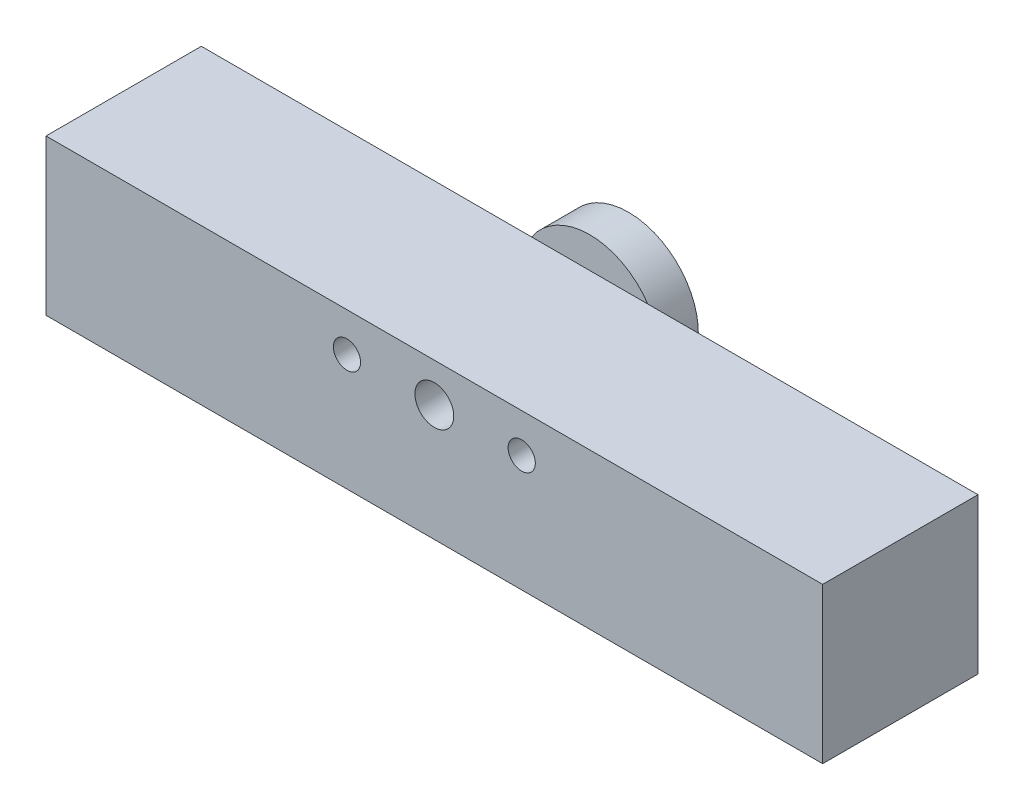
ISO-10303-21;
HEADER;
FILE_DESCRIPTION(('STEP AP214'),'2;1');
FILE_NAME('part.step','',(''),(''),'','','');
FILE_SCHEMA(('AUTOMOTIVE_DESIGN { 1 0 10303 214 1 1 1 1 }'));
ENDSEC;
DATA;
#1=APPLICATION_CONTEXT('core data for automotive mechanical design processes');
#2=APPLICATION_PROTOCOL_DEFINITION('international standard','automotive_design',2000,#1);
#3=PRODUCT_CONTEXT('',#1,'mechanical');
#4=PRODUCT('Part','Part','',(#3));
#5=PRODUCT_RELATED_PRODUCT_CATEGORY('part','',(#4));
#6=PRODUCT_DEFINITION_FORMATION('','',#4);
#7=PRODUCT_DEFINITION_CONTEXT('part definition',#1,'design');
#8=PRODUCT_DEFINITION('design','',#6,#7);
#9=PRODUCT_DEFINITION_SHAPE('','',#8);
#10=(LENGTH_UNIT() NAMED_UNIT(*) SI_UNIT(.MILLI.,.METRE.));
#11=(NAMED_UNIT(*) PLANE_ANGLE_UNIT() SI_UNIT($,.RADIAN.));
#12=(NAMED_UNIT(*) SI_UNIT($,.STERADIAN.) SOLID_ANGLE_UNIT());
#13=UNCERTAINTY_MEASURE_WITH_UNIT(LENGTH_MEASURE(1.E-05),#10,'distance_accuracy_value','');
#14=(GEOMETRIC_REPRESENTATION_CONTEXT(3) GLOBAL_UNCERTAINTY_ASSIGNED_CONTEXT((#13)) GLOBAL_UNIT_ASSIGNED_CONTEXT((#10,
#11,#12)) REPRESENTATION_CONTEXT('',''));
#15=CARTESIAN_POINT('',(0.,0.,0.));
#16=DIRECTION('',(0.,0.,1.));
#17=DIRECTION('',(1.,0.,0.));
#18=AXIS2_PLACEMENT_3D('',#15,#16,#17);
#19=CARTESIAN_POINT('',(0.,40.,0.));
#20=DIRECTION('',(1.,0.,0.));
#21=DIRECTION('',(0.,0.,-1.));
#22=AXIS2_PLACEMENT_3D('',#19,#20,#21);
#23=PLANE('',#22);
#24=DIRECTION('',(0.,0.,1.));
#25=VECTOR('',#24,1.);
#26=CARTESIAN_POINT('',(0.,0.,0.));
#27=LINE('',#26,#25);
#28=CARTESIAN_POINT('',(0.,0.,-40.));
#29=VERTEX_POINT('',#28);
#30=CARTESIAN_POINT('',(0.,0.,0.));
#31=VERTEX_POINT('',#30);
#32=EDGE_CURVE('E117',#29,#31,#27,.T.);
#33=ORIENTED_EDGE('',*,*,#32,.T.);
#34=DIRECTION('',(0.,-1.,0.));
#35=VECTOR('',#34,1.);
#36=CARTESIAN_POINT('',(0.,40.,0.));
#37=LINE('',#36,#35);
#38=CARTESIAN_POINT('',(0.,40.,0.));
#39=VERTEX_POINT('',#38);
#40=EDGE_CURVE('E48',#39,#31,#37,.T.);
#41=ORIENTED_EDGE('',*,*,#40,.F.);
#42=DIRECTION('',(0.,0.,1.));
#43=VECTOR('',#42,1.);
#44=CARTESIAN_POINT('',(0.,40.,0.));
#45=LINE('',#44,#43);
#46=CARTESIAN_POINT('',(0.,40.,-40.));
#47=VERTEX_POINT('',#46);
#48=EDGE_CURVE('E123',#47,#39,#45,.T.);
#49=ORIENTED_EDGE('',*,*,#48,.F.);
#50=DIRECTION('',(0.,-1.,0.));
#51=VECTOR('',#50,1.);
#52=CARTESIAN_POINT('',(0.,40.,-40.));
#53=LINE('',#52,#51);
#54=EDGE_CURVE('E104',#47,#29,#53,.T.);
#55=ORIENTED_EDGE('',*,*,#54,.T.);
#56=EDGE_LOOP('',(#33,#41,#49,#55));
#57=FACE_BOUND('',#56,.T.);
#58=ADVANCED_FACE('F39',(#57),#23,.F.);
#59=CARTESIAN_POINT('',(0.,40.,0.));
#60=DIRECTION('',(0.,0.,-1.));
#61=DIRECTION('',(-1.,0.,0.));
#62=AXIS2_PLACEMENT_3D('',#59,#60,#61);
#63=PLANE('',#62);
#64=CARTESIAN_POINT('',(77.5,30.,0.));
#65=DIRECTION('',(0.,0.,-1.));
#66=DIRECTION('',(-1.,0.,0.));
#67=AXIS2_PLACEMENT_3D('',#64,#65,#66);
#68=CIRCLE('',#67,3.50000000000001);
#69=CARTESIAN_POINT('',(74.,30.,0.));
#70=VERTEX_POINT('',#69);
#71=EDGE_CURVE('E165',#70,#70,#68,.T.);
#72=ORIENTED_EDGE('',*,*,#71,.T.);
#73=EDGE_LOOP('',(#72));
#74=FACE_BOUND('',#73,.T.);
#75=CARTESIAN_POINT('',(122.5,30.,0.));
#76=DIRECTION('',(0.,0.,-1.));
#77=DIRECTION('',(-1.,0.,0.));
#78=AXIS2_PLACEMENT_3D('',#75,#76,#77);
#79=CIRCLE('',#78,3.50000000000002);
#80=CARTESIAN_POINT('',(119.,30.,0.));
#81=VERTEX_POINT('',#80);
#82=EDGE_CURVE('E155',#81,#81,#79,.T.);
#83=ORIENTED_EDGE('',*,*,#82,.T.);
#84=EDGE_LOOP('',(#83));
#85=FACE_BOUND('',#84,.T.);
#86=CARTESIAN_POINT('',(100.,30.,0.));
#87=DIRECTION('',(0.,0.,-1.));
#88=DIRECTION('',(-1.,0.,0.));
#89=AXIS2_PLACEMENT_3D('',#86,#87,#88);
#90=CIRCLE('',#89,5.00000000000001);
#91=CARTESIAN_POINT('',(95.,30.,0.));
#92=VERTEX_POINT('',#91);
#93=EDGE_CURVE('E113',#92,#92,#90,.T.);
#94=ORIENTED_EDGE('',*,*,#93,.T.);
#95=EDGE_LOOP('',(#94));
#96=FACE_BOUND('',#95,.T.);
#97=DIRECTION('',(1.,0.,0.));
#98=VECTOR('',#97,1.);
#99=CARTESIAN_POINT('',(0.,0.,0.));
#100=LINE('',#99,#98);
#101=CARTESIAN_POINT('',(200.,0.,0.));
#102=VERTEX_POINT('',#101);
#103=EDGE_CURVE('E134',#31,#102,#100,.T.);
#104=ORIENTED_EDGE('',*,*,#103,.T.);
#105=DIRECTION('',(0.,-1.,0.));
#106=VECTOR('',#105,1.);
#107=CARTESIAN_POINT('',(200.,40.,0.));
#108=LINE('',#107,#106);
#109=CARTESIAN_POINT('',(200.,40.,0.));
#110=VERTEX_POINT('',#109);
#111=EDGE_CURVE('E147',#110,#102,#108,.T.);
#112=ORIENTED_EDGE('',*,*,#111,.F.);
#113=DIRECTION('',(1.,0.,0.));
#114=VECTOR('',#113,1.);
#115=CARTESIAN_POINT('',(0.,40.,0.));
#116=LINE('',#115,#114);
#117=EDGE_CURVE('E92',#39,#110,#116,.T.);
#118=ORIENTED_EDGE('',*,*,#117,.F.);
#119=ORIENTED_EDGE('',*,*,#40,.T.);
#120=EDGE_LOOP('',(#104,#112,#118,#119));
#121=FACE_BOUND('',#120,.T.);
#122=ADVANCED_FACE('F194',(#74,#85,#96,#121),#63,.F.);
#123=CARTESIAN_POINT('',(200.,40.,0.));
#124=DIRECTION('',(-1.,0.,0.));
#125=DIRECTION('',(0.,0.,1.));
#126=AXIS2_PLACEMENT_3D('',#123,#124,#125);
#127=PLANE('',#126);
#128=DIRECTION('',(0.,0.,-1.));
#129=VECTOR('',#128,1.);
#130=CARTESIAN_POINT('',(200.,0.,0.));
#131=LINE('',#130,#129);
#132=CARTESIAN_POINT('',(200.,0.,-40.));
#133=VERTEX_POINT('',#132);
#134=EDGE_CURVE('E137',#102,#133,#131,.T.);
#135=ORIENTED_EDGE('',*,*,#134,.T.);
#136=DIRECTION('',(0.,-1.,0.));
#137=VECTOR('',#136,1.);
#138=CARTESIAN_POINT('',(200.,40.,-40.));
#139=LINE('',#138,#137);
#140=CARTESIAN_POINT('',(200.,40.,-40.));
#141=VERTEX_POINT('',#140);
#142=EDGE_CURVE('E144',#141,#133,#139,.T.);
#143=ORIENTED_EDGE('',*,*,#142,.F.);
#144=DIRECTION('',(0.,0.,-1.));
#145=VECTOR('',#144,1.);
#146=CARTESIAN_POINT('',(200.,40.,0.));
#147=LINE('',#146,#145);
#148=EDGE_CURVE('E107',#110,#141,#147,.T.);
#149=ORIENTED_EDGE('',*,*,#148,.F.);
#150=ORIENTED_EDGE('',*,*,#111,.T.);
#151=EDGE_LOOP('',(#135,#143,#149,#150));
#152=FACE_BOUND('',#151,.T.);
#153=ADVANCED_FACE('F199',(#152),#127,.F.);
#154=CARTESIAN_POINT('',(0.,40.,-40.));
#155=DIRECTION('',(0.,0.,1.));
#156=DIRECTION('',(1.,0.,0.));
#157=AXIS2_PLACEMENT_3D('',#154,#155,#156);
#158=PLANE('',#157);
#159=CARTESIAN_POINT('',(77.5,30.,-40.));
#160=DIRECTION('',(0.,0.,1.));
#161=DIRECTION('',(1.,0.,0.));
#162=AXIS2_PLACEMENT_3D('',#159,#160,#161);
#163=CIRCLE('',#162,3.50000000000001);
#164=CARTESIAN_POINT('',(81.,30.,-40.));
#165=VERTEX_POINT('',#164);
#166=EDGE_CURVE('E42',#165,#165,#163,.T.);
#167=ORIENTED_EDGE('',*,*,#166,.T.);
#168=EDGE_LOOP('',(#167));
#169=FACE_BOUND('',#168,.T.);
#170=CARTESIAN_POINT('',(122.5,30.,-40.));
#171=DIRECTION('',(0.,0.,1.));
#172=DIRECTION('',(1.,0.,0.));
#173=AXIS2_PLACEMENT_3D('',#170,#171,#172);
#174=CIRCLE('',#173,3.50000000000002);
#175=CARTESIAN_POINT('',(126.,30.,-40.));
#176=VERTEX_POINT('',#175);
#177=EDGE_CURVE('E152',#176,#176,#174,.T.);
#178=ORIENTED_EDGE('',*,*,#177,.T.);
#179=EDGE_LOOP('',(#178));
#180=FACE_BOUND('',#179,.T.);
#181=CARTESIAN_POINT('',(100.,30.,-40.));
#182=DIRECTION('',(0.,0.,-1.));
#183=DIRECTION('',(-1.,0.,0.));
#184=AXIS2_PLACEMENT_3D('',#181,#182,#183);
#185=CIRCLE('',#184,18.);
#186=CARTESIAN_POINT('',(114.966629547096,40.,-40.));
#187=VERTEX_POINT('',#186);
#188=CARTESIAN_POINT('',(85.0333704529042,40.,-40.));
#189=VERTEX_POINT('',#188);
#190=EDGE_CURVE('E11',#187,#189,#185,.T.);
#191=ORIENTED_EDGE('',*,*,#190,.F.);
#192=DIRECTION('',(-1.,0.,0.));
#193=VECTOR('',#192,1.);
#194=CARTESIAN_POINT('',(0.,40.,-40.));
#195=LINE('',#194,#193);
#196=EDGE_CURVE('E97',#141,#187,#195,.T.);
#197=ORIENTED_EDGE('',*,*,#196,.F.);
#198=ORIENTED_EDGE('',*,*,#142,.T.);
#199=DIRECTION('',(-1.,0.,0.));
#200=VECTOR('',#199,1.);
#201=CARTESIAN_POINT('',(0.,0.,-40.));
#202=LINE('',#201,#200);
#203=EDGE_CURVE('E84',#133,#29,#202,.T.);
#204=ORIENTED_EDGE('',*,*,#203,.T.);
#205=ORIENTED_EDGE('',*,*,#54,.F.);
#206=EDGE_CURVE('E63',#189,#47,#195,.T.);
#207=ORIENTED_EDGE('',*,*,#206,.F.);
#208=EDGE_LOOP('',(#191,#197,#198,#204,#205,#207));
#209=FACE_BOUND('',#208,.T.);
#210=ADVANCED_FACE('F103',(#169,#180,#209),#158,.F.);
#211=CARTESIAN_POINT('',(0.,40.,0.));
#212=DIRECTION('',(0.,-1.,0.));
#213=DIRECTION('',(0.,0.,-1.));
#214=AXIS2_PLACEMENT_3D('',#211,#212,#213);
#215=PLANE('',#214);
#216=ORIENTED_EDGE('',*,*,#48,.T.);
#217=ORIENTED_EDGE('',*,*,#117,.T.);
#218=ORIENTED_EDGE('',*,*,#148,.T.);
#219=ORIENTED_EDGE('',*,*,#196,.T.);
#220=EDGE_CURVE('E95',#187,#189,#195,.T.);
#221=ORIENTED_EDGE('',*,*,#220,.T.);
#222=ORIENTED_EDGE('',*,*,#206,.T.);
#223=EDGE_LOOP('',(#216,#217,#218,#219,#221,#222));
#224=FACE_BOUND('',#223,.T.);
#225=ADVANCED_FACE('F96',(#224),#215,.F.);
#226=CARTESIAN_POINT('',(0.,0.,0.));
#227=DIRECTION('',(0.,-1.,0.));
#228=DIRECTION('',(0.,0.,-1.));
#229=AXIS2_PLACEMENT_3D('',#226,#227,#228);
#230=PLANE('',#229);
#231=ORIENTED_EDGE('',*,*,#32,.F.);
#232=ORIENTED_EDGE('',*,*,#203,.F.);
#233=ORIENTED_EDGE('',*,*,#134,.F.);
#234=ORIENTED_EDGE('',*,*,#103,.F.);
#235=EDGE_LOOP('',(#231,#232,#233,#234));
#236=FACE_BOUND('',#235,.T.);
#237=ADVANCED_FACE('F184',(#236),#230,.T.);
#238=CARTESIAN_POINT('',(100.,30.,-50.));
#239=DIRECTION('',(0.,0.,1.));
#240=DIRECTION('',(1.,0.,0.));
#241=AXIS2_PLACEMENT_3D('',#238,#239,#240);
#242=CYLINDRICAL_SURFACE('',#241,18.);
#243=CARTESIAN_POINT('',(100.,30.,-50.));
#244=DIRECTION('',(0.,0.,-1.));
#245=DIRECTION('',(-1.,0.,0.));
#246=AXIS2_PLACEMENT_3D('',#243,#244,#245);
#247=CIRCLE('',#246,18.);
#248=CARTESIAN_POINT('',(82.,30.,-50.));
#249=VERTEX_POINT('',#248);
#250=EDGE_CURVE('E112',#249,#249,#247,.T.);
#251=ORIENTED_EDGE('',*,*,#250,.F.);
#252=EDGE_LOOP('',(#251));
#253=FACE_BOUND('',#252,.T.);
#254=EDGE_CURVE('E50',#189,#187,#185,.T.);
#255=ORIENTED_EDGE('',*,*,#254,.T.);
#256=ORIENTED_EDGE('',*,*,#190,.T.);
#257=EDGE_LOOP('',(#255,#256));
#258=FACE_BOUND('',#257,.T.);
#259=ADVANCED_FACE('F109',(#253,#258),#242,.T.);
#260=CARTESIAN_POINT('',(100.,30.,-50.));
#261=DIRECTION('',(0.,0.,-1.));
#262=DIRECTION('',(-1.,0.,0.));
#263=AXIS2_PLACEMENT_3D('',#260,#261,#262);
#264=PLANE('',#263);
#265=CARTESIAN_POINT('',(100.,30.,-50.));
#266=DIRECTION('',(0.,0.,-1.));
#267=DIRECTION('',(-1.,0.,0.));
#268=AXIS2_PLACEMENT_3D('',#265,#266,#267);
#269=CIRCLE('',#268,5.00000000000001);
#270=CARTESIAN_POINT('',(95.,30.,-50.));
#271=VERTEX_POINT('',#270);
#272=EDGE_CURVE('E120',#271,#271,#269,.T.);
#273=ORIENTED_EDGE('',*,*,#272,.F.);
#274=EDGE_LOOP('',(#273));
#275=FACE_BOUND('',#274,.T.);
#276=ORIENTED_EDGE('',*,*,#250,.T.);
#277=EDGE_LOOP('',(#276));
#278=FACE_BOUND('',#277,.T.);
#279=ADVANCED_FACE('F177',(#275,#278),#264,.T.);
#280=CARTESIAN_POINT('',(100.,30.,-40.));
#281=DIRECTION('',(0.,0.,-1.));
#282=DIRECTION('',(-1.,0.,0.));
#283=AXIS2_PLACEMENT_3D('',#280,#281,#282);
#284=PLANE('',#283);
#285=ORIENTED_EDGE('',*,*,#220,.F.);
#286=ORIENTED_EDGE('',*,*,#254,.F.);
#287=EDGE_LOOP('',(#285,#286));
#288=FACE_BOUND('',#287,.T.);
#289=ADVANCED_FACE('F110',(#288),#284,.F.);
#290=CARTESIAN_POINT('',(100.,30.,0.999999999999994));
#291=DIRECTION('',(0.,0.,-1.));
#292=DIRECTION('',(-1.,0.,0.));
#293=AXIS2_PLACEMENT_3D('',#290,#291,#292);
#294=CYLINDRICAL_SURFACE('',#293,5.00000000000001);
#295=ORIENTED_EDGE('',*,*,#272,.T.);
#296=EDGE_LOOP('',(#295));
#297=FACE_BOUND('',#296,.T.);
#298=ORIENTED_EDGE('',*,*,#93,.F.);
#299=EDGE_LOOP('',(#298));
#300=FACE_BOUND('',#299,.T.);
#301=ADVANCED_FACE('F174',(#297,#300),#294,.F.);
#302=CARTESIAN_POINT('',(122.5,30.,0.999999999999994));
#303=DIRECTION('',(0.,0.,-1.));
#304=DIRECTION('',(-1.,0.,0.));
#305=AXIS2_PLACEMENT_3D('',#302,#303,#304);
#306=CYLINDRICAL_SURFACE('',#305,3.50000000000002);
#307=ORIENTED_EDGE('',*,*,#177,.F.);
#308=EDGE_LOOP('',(#307));
#309=FACE_BOUND('',#308,.T.);
#310=ORIENTED_EDGE('',*,*,#82,.F.);
#311=EDGE_LOOP('',(#310));
#312=FACE_BOUND('',#311,.T.);
#313=ADVANCED_FACE('F252',(#309,#312),#306,.F.);
#314=CARTESIAN_POINT('',(77.5,30.,0.999999999999994));
#315=DIRECTION('',(0.,0.,-1.));
#316=DIRECTION('',(-1.,0.,0.));
#317=AXIS2_PLACEMENT_3D('',#314,#315,#316);
#318=CYLINDRICAL_SURFACE('',#317,3.50000000000001);
#319=ORIENTED_EDGE('',*,*,#166,.F.);
#320=EDGE_LOOP('',(#319));
#321=FACE_BOUND('',#320,.T.);
#322=ORIENTED_EDGE('',*,*,#71,.F.);
#323=EDGE_LOOP('',(#322));
#324=FACE_BOUND('',#323,.T.);
#325=ADVANCED_FACE('F257',(#321,#324),#318,.F.);
#326=CLOSED_SHELL('',(#58,#122,#153,#210,#225,#237,#259,#279,#289,#301,#313,#325));
#327=MANIFOLD_SOLID_BREP('B2',#326);
#328=ADVANCED_BREP_SHAPE_REPRESENTATION('',(#18,#327),#14);
#329=SHAPE_DEFINITION_REPRESENTATION(#9,#328);
ENDSEC;
END-ISO-10303-21;
